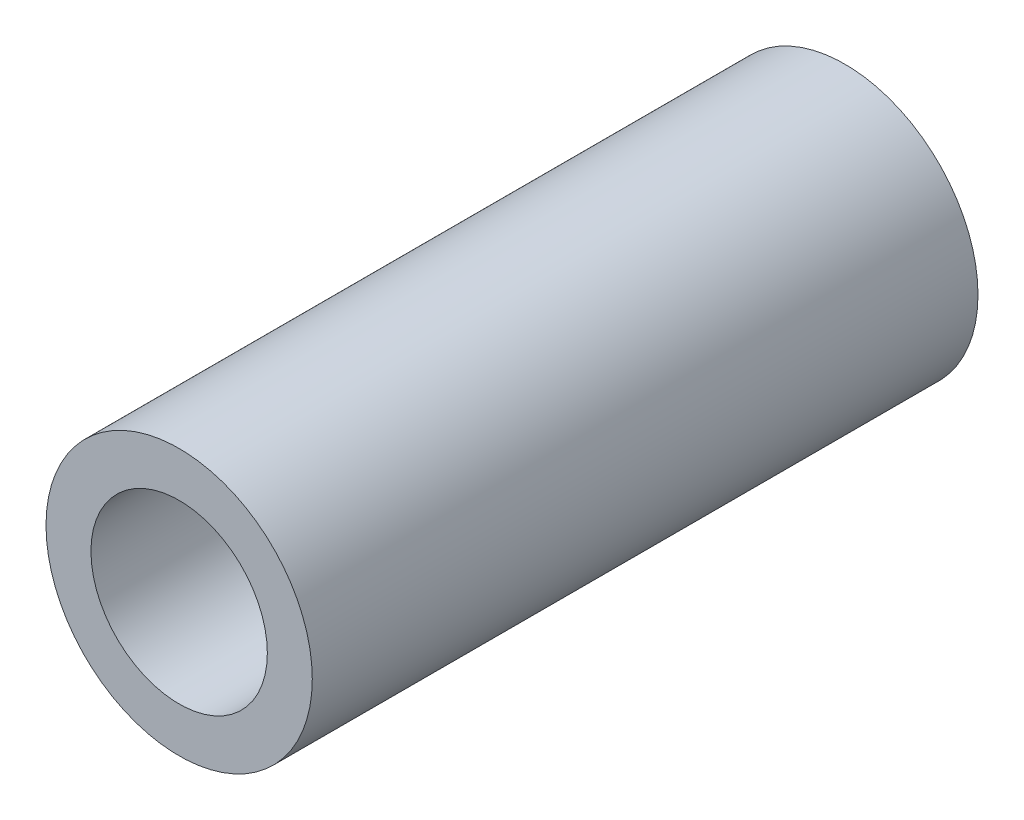
ISO-10303-21;
HEADER;
FILE_DESCRIPTION(('STEP AP214'),'2;1');
FILE_NAME('part.step','',(''),(''),'','','');
FILE_SCHEMA(('AUTOMOTIVE_DESIGN { 1 0 10303 214 1 1 1 1 }'));
ENDSEC;
DATA;
#1=APPLICATION_CONTEXT('core data for automotive mechanical design processes');
#2=APPLICATION_PROTOCOL_DEFINITION('international standard','automotive_design',2000,#1);
#3=PRODUCT_CONTEXT('',#1,'mechanical');
#4=PRODUCT('Part','Part','',(#3));
#5=PRODUCT_RELATED_PRODUCT_CATEGORY('part','',(#4));
#6=PRODUCT_DEFINITION_FORMATION('','',#4);
#7=PRODUCT_DEFINITION_CONTEXT('part definition',#1,'design');
#8=PRODUCT_DEFINITION('design','',#6,#7);
#9=PRODUCT_DEFINITION_SHAPE('','',#8);
#10=(LENGTH_UNIT() NAMED_UNIT(*) SI_UNIT(.MILLI.,.METRE.));
#11=(NAMED_UNIT(*) PLANE_ANGLE_UNIT() SI_UNIT($,.RADIAN.));
#12=(NAMED_UNIT(*) SI_UNIT($,.STERADIAN.) SOLID_ANGLE_UNIT());
#13=UNCERTAINTY_MEASURE_WITH_UNIT(LENGTH_MEASURE(1.E-05),#10,'distance_accuracy_value','');
#14=(GEOMETRIC_REPRESENTATION_CONTEXT(3) GLOBAL_UNCERTAINTY_ASSIGNED_CONTEXT((#13)) GLOBAL_UNIT_ASSIGNED_CONTEXT((#10,
#11,#12)) REPRESENTATION_CONTEXT('',''));
#15=CARTESIAN_POINT('',(0.,0.,0.));
#16=DIRECTION('',(0.,0.,1.));
#17=DIRECTION('',(1.,0.,0.));
#18=AXIS2_PLACEMENT_3D('',#15,#16,#17);
#19=CARTESIAN_POINT('',(0.,0.,10.));
#20=DIRECTION('',(0.,0.,1.));
#21=DIRECTION('',(1.,0.,0.));
#22=AXIS2_PLACEMENT_3D('',#19,#20,#21);
#23=PLANE('',#22);
#24=CARTESIAN_POINT('',(0.,0.,10.));
#25=DIRECTION('',(0.,0.,1.));
#26=DIRECTION('',(1.,0.,0.));
#27=AXIS2_PLACEMENT_3D('',#24,#25,#26);
#28=CIRCLE('',#27,4.);
#29=CARTESIAN_POINT('',(4.,0.,10.));
#30=VERTEX_POINT('',#29);
#31=EDGE_CURVE('E10',#30,#30,#28,.T.);
#32=ORIENTED_EDGE('',*,*,#31,.T.);
#33=EDGE_LOOP('',(#32));
#34=FACE_BOUND('',#33,.T.);
#35=CARTESIAN_POINT('',(0.,0.,10.));
#36=DIRECTION('',(0.,0.,1.));
#37=DIRECTION('',(1.,0.,0.));
#38=AXIS2_PLACEMENT_3D('',#35,#36,#37);
#39=CIRCLE('',#38,2.65);
#40=CARTESIAN_POINT('',(2.65,0.,10.));
#41=VERTEX_POINT('',#40);
#42=EDGE_CURVE('E41',#41,#41,#39,.T.);
#43=ORIENTED_EDGE('',*,*,#42,.F.);
#44=EDGE_LOOP('',(#43));
#45=FACE_BOUND('',#44,.T.);
#46=ADVANCED_FACE('F30',(#34,#45),#23,.T.);
#47=CARTESIAN_POINT('',(0.,0.,-10.));
#48=DIRECTION('',(0.,0.,1.));
#49=DIRECTION('',(1.,0.,0.));
#50=AXIS2_PLACEMENT_3D('',#47,#48,#49);
#51=PLANE('',#50);
#52=CARTESIAN_POINT('',(0.,0.,-10.));
#53=DIRECTION('',(0.,0.,1.));
#54=DIRECTION('',(1.,0.,0.));
#55=AXIS2_PLACEMENT_3D('',#52,#53,#54);
#56=CIRCLE('',#55,4.);
#57=CARTESIAN_POINT('',(4.,0.,-10.));
#58=VERTEX_POINT('',#57);
#59=EDGE_CURVE('E34',#58,#58,#56,.T.);
#60=ORIENTED_EDGE('',*,*,#59,.F.);
#61=EDGE_LOOP('',(#60));
#62=FACE_BOUND('',#61,.T.);
#63=CARTESIAN_POINT('',(0.,0.,-10.));
#64=DIRECTION('',(0.,0.,1.));
#65=DIRECTION('',(1.,0.,0.));
#66=AXIS2_PLACEMENT_3D('',#63,#64,#65);
#67=CIRCLE('',#66,2.65);
#68=CARTESIAN_POINT('',(2.65,0.,-10.));
#69=VERTEX_POINT('',#68);
#70=EDGE_CURVE('E43',#69,#69,#67,.T.);
#71=ORIENTED_EDGE('',*,*,#70,.T.);
#72=EDGE_LOOP('',(#71));
#73=FACE_BOUND('',#72,.T.);
#74=ADVANCED_FACE('F53',(#62,#73),#51,.F.);
#75=CARTESIAN_POINT('',(0.,0.,10.));
#76=DIRECTION('',(0.,0.,-1.));
#77=DIRECTION('',(-1.,0.,0.));
#78=AXIS2_PLACEMENT_3D('',#75,#76,#77);
#79=CYLINDRICAL_SURFACE('',#78,4.);
#80=ORIENTED_EDGE('',*,*,#31,.F.);
#81=EDGE_LOOP('',(#80));
#82=FACE_BOUND('',#81,.T.);
#83=ORIENTED_EDGE('',*,*,#59,.T.);
#84=EDGE_LOOP('',(#83));
#85=FACE_BOUND('',#84,.T.);
#86=ADVANCED_FACE('F32',(#82,#85),#79,.T.);
#87=CARTESIAN_POINT('',(0.,0.,10.));
#88=DIRECTION('',(0.,0.,-1.));
#89=DIRECTION('',(-1.,0.,0.));
#90=AXIS2_PLACEMENT_3D('',#87,#88,#89);
#91=CYLINDRICAL_SURFACE('',#90,2.65);
#92=ORIENTED_EDGE('',*,*,#42,.T.);
#93=EDGE_LOOP('',(#92));
#94=FACE_BOUND('',#93,.T.);
#95=ORIENTED_EDGE('',*,*,#70,.F.);
#96=EDGE_LOOP('',(#95));
#97=FACE_BOUND('',#96,.T.);
#98=ADVANCED_FACE('F49',(#94,#97),#91,.F.);
#99=CLOSED_SHELL('',(#46,#74,#86,#98));
#100=MANIFOLD_SOLID_BREP('B2',#99);
#101=ADVANCED_BREP_SHAPE_REPRESENTATION('',(#18,#100),#14);
#102=SHAPE_DEFINITION_REPRESENTATION(#9,#101);
ENDSEC;
END-ISO-10303-21;
